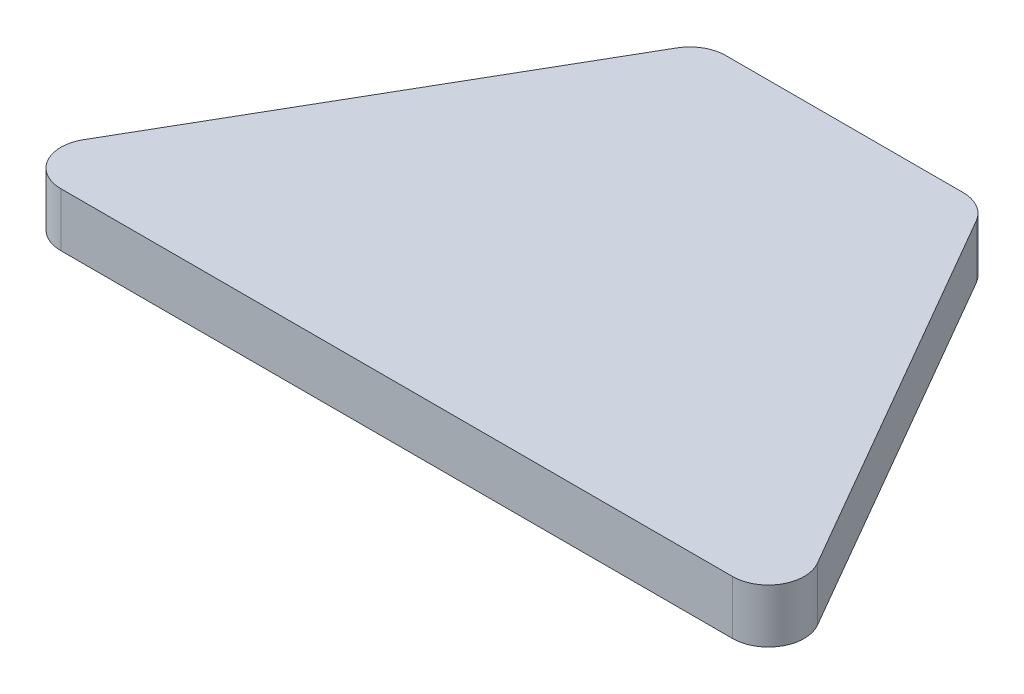
ISO-10303-21;
HEADER;
FILE_DESCRIPTION(('STEP AP214'),'2;1');
FILE_NAME('part.step','',(''),(''),'','','');
FILE_SCHEMA(('AUTOMOTIVE_DESIGN { 1 0 10303 214 1 1 1 1 }'));
ENDSEC;
DATA;
#1=APPLICATION_CONTEXT('core data for automotive mechanical design processes');
#2=APPLICATION_PROTOCOL_DEFINITION('international standard','automotive_design',2000,#1);
#3=PRODUCT_CONTEXT('',#1,'mechanical');
#4=PRODUCT('Part','Part','',(#3));
#5=PRODUCT_RELATED_PRODUCT_CATEGORY('part','',(#4));
#6=PRODUCT_DEFINITION_FORMATION('','',#4);
#7=PRODUCT_DEFINITION_CONTEXT('part definition',#1,'design');
#8=PRODUCT_DEFINITION('design','',#6,#7);
#9=PRODUCT_DEFINITION_SHAPE('','',#8);
#10=(LENGTH_UNIT() NAMED_UNIT(*) SI_UNIT(.MILLI.,.METRE.));
#11=(NAMED_UNIT(*) PLANE_ANGLE_UNIT() SI_UNIT($,.RADIAN.));
#12=(NAMED_UNIT(*) SI_UNIT($,.STERADIAN.) SOLID_ANGLE_UNIT());
#13=UNCERTAINTY_MEASURE_WITH_UNIT(LENGTH_MEASURE(1.E-05),#10,'distance_accuracy_value','');
#14=(GEOMETRIC_REPRESENTATION_CONTEXT(3) GLOBAL_UNCERTAINTY_ASSIGNED_CONTEXT((#13)) GLOBAL_UNIT_ASSIGNED_CONTEXT((#10,
#11,#12)) REPRESENTATION_CONTEXT('',''));
#15=CARTESIAN_POINT('',(0.,0.,0.));
#16=DIRECTION('',(0.,0.,1.));
#17=DIRECTION('',(1.,0.,0.));
#18=AXIS2_PLACEMENT_3D('',#15,#16,#17);
#19=CARTESIAN_POINT('',(22.2168783648704,1.5,12.5));
#20=DIRECTION('',(0.,0.,-1.));
#21=DIRECTION('',(-1.,0.,0.));
#22=AXIS2_PLACEMENT_3D('',#19,#20,#21);
#23=PLANE('',#22);
#24=DIRECTION('',(1.,0.,0.));
#25=VECTOR('',#24,1.);
#26=CARTESIAN_POINT('',(22.2168783648704,-1.5,12.5));
#27=LINE('',#26,#25);
#28=CARTESIAN_POINT('',(-18.7527767497326,-1.5,12.5));
#29=VERTEX_POINT('',#28);
#30=CARTESIAN_POINT('',(18.7527767497326,-1.5,12.5));
#31=VERTEX_POINT('',#30);
#32=EDGE_CURVE('E157',#29,#31,#27,.T.);
#33=ORIENTED_EDGE('',*,*,#32,.T.);
#34=DIRECTION('',(0.,-1.,0.));
#35=VECTOR('',#34,1.);
#36=CARTESIAN_POINT('',(18.7527767497326,1.5,12.5));
#37=LINE('',#36,#35);
#38=CARTESIAN_POINT('',(18.7527767497326,1.5,12.5));
#39=VERTEX_POINT('',#38);
#40=EDGE_CURVE('E11',#31,#39,#37,.F.);
#41=ORIENTED_EDGE('',*,*,#40,.T.);
#42=DIRECTION('',(1.,0.,0.));
#43=VECTOR('',#42,1.);
#44=CARTESIAN_POINT('',(-22.2168783648704,1.5,12.5));
#45=LINE('',#44,#43);
#46=CARTESIAN_POINT('',(-18.7527767497326,1.5,12.5));
#47=VERTEX_POINT('',#46);
#48=EDGE_CURVE('E125',#47,#39,#45,.T.);
#49=ORIENTED_EDGE('',*,*,#48,.F.);
#50=DIRECTION('',(0.,-1.,0.));
#51=VECTOR('',#50,1.);
#52=CARTESIAN_POINT('',(-18.7527767497326,1.5,12.5));
#53=LINE('',#52,#51);
#54=EDGE_CURVE('E41',#47,#29,#53,.T.);
#55=ORIENTED_EDGE('',*,*,#54,.T.);
#56=EDGE_LOOP('',(#33,#41,#49,#55));
#57=FACE_BOUND('',#56,.T.);
#58=ADVANCED_FACE('F33',(#57),#23,.F.);
#59=CARTESIAN_POINT('',(7.7831216351296,1.5,-12.5));
#60=DIRECTION('',(-0.866025403784436,0.,0.500000000000004));
#61=DIRECTION('',(0.500000000000004,0.,0.866025403784437));
#62=AXIS2_PLACEMENT_3D('',#59,#60,#61);
#63=PLANE('',#62);
#64=DIRECTION('',(-0.500000000000004,0.,-0.866025403784436));
#65=VECTOR('',#64,1.);
#66=CARTESIAN_POINT('',(7.7831216351296,-1.5,-12.5));
#67=LINE('',#66,#65);
#68=CARTESIAN_POINT('',(20.4848275573015,-1.5,9.49999999999998));
#69=VERTEX_POINT('',#68);
#70=CARTESIAN_POINT('',(8.36047190431923,-1.5,-11.5));
#71=VERTEX_POINT('',#70);
#72=EDGE_CURVE('E130',#69,#71,#67,.T.);
#73=ORIENTED_EDGE('',*,*,#72,.T.);
#74=DIRECTION('',(0.,-1.,0.));
#75=VECTOR('',#74,1.);
#76=CARTESIAN_POINT('',(8.36047190431923,1.5,-11.5));
#77=LINE('',#76,#75);
#78=CARTESIAN_POINT('',(8.36047190431923,1.5,-11.5));
#79=VERTEX_POINT('',#78);
#80=EDGE_CURVE('E48',#71,#79,#77,.F.);
#81=ORIENTED_EDGE('',*,*,#80,.T.);
#82=DIRECTION('',(-0.500000000000004,0.,-0.866025403784436));
#83=VECTOR('',#82,1.);
#84=CARTESIAN_POINT('',(7.7831216351296,1.5,-12.5));
#85=LINE('',#84,#83);
#86=CARTESIAN_POINT('',(20.4848275573015,1.5,9.49999999999998));
#87=VERTEX_POINT('',#86);
#88=EDGE_CURVE('E128',#87,#79,#85,.T.);
#89=ORIENTED_EDGE('',*,*,#88,.F.);
#90=DIRECTION('',(0.,-1.,0.));
#91=VECTOR('',#90,1.);
#92=CARTESIAN_POINT('',(20.4848275573015,1.5,9.49999999999999));
#93=LINE('',#92,#91);
#94=EDGE_CURVE('E149',#87,#69,#93,.T.);
#95=ORIENTED_EDGE('',*,*,#94,.T.);
#96=EDGE_LOOP('',(#73,#81,#89,#95));
#97=FACE_BOUND('',#96,.T.);
#98=ADVANCED_FACE('F177',(#97),#63,.F.);
#99=CARTESIAN_POINT('',(-7.7831216351296,1.5,-12.5));
#100=DIRECTION('',(0.,0.,1.));
#101=DIRECTION('',(1.,0.,0.));
#102=AXIS2_PLACEMENT_3D('',#99,#100,#101);
#103=PLANE('',#102);
#104=DIRECTION('',(-1.,0.,0.));
#105=VECTOR('',#104,1.);
#106=CARTESIAN_POINT('',(-7.7831216351296,-1.5,-12.5));
#107=LINE('',#106,#105);
#108=CARTESIAN_POINT('',(6.62842109675035,-1.5,-12.5));
#109=VERTEX_POINT('',#108);
#110=CARTESIAN_POINT('',(-6.62842109675035,-1.5,-12.5));
#111=VERTEX_POINT('',#110);
#112=EDGE_CURVE('E126',#109,#111,#107,.T.);
#113=ORIENTED_EDGE('',*,*,#112,.T.);
#114=DIRECTION('',(0.,-1.,0.));
#115=VECTOR('',#114,1.);
#116=CARTESIAN_POINT('',(-6.62842109675035,1.5,-12.5));
#117=LINE('',#116,#115);
#118=CARTESIAN_POINT('',(-6.62842109675035,1.5,-12.5));
#119=VERTEX_POINT('',#118);
#120=EDGE_CURVE('E104',#111,#119,#117,.F.);
#121=ORIENTED_EDGE('',*,*,#120,.T.);
#122=DIRECTION('',(-1.,0.,0.));
#123=VECTOR('',#122,1.);
#124=CARTESIAN_POINT('',(-7.7831216351296,1.5,-12.5));
#125=LINE('',#124,#123);
#126=CARTESIAN_POINT('',(6.62842109675035,1.5,-12.5));
#127=VERTEX_POINT('',#126);
#128=EDGE_CURVE('E165',#127,#119,#125,.T.);
#129=ORIENTED_EDGE('',*,*,#128,.F.);
#130=DIRECTION('',(0.,-1.,0.));
#131=VECTOR('',#130,1.);
#132=CARTESIAN_POINT('',(6.62842109675035,1.5,-12.5));
#133=LINE('',#132,#131);
#134=EDGE_CURVE('E109',#127,#109,#133,.T.);
#135=ORIENTED_EDGE('',*,*,#134,.T.);
#136=EDGE_LOOP('',(#113,#121,#129,#135));
#137=FACE_BOUND('',#136,.T.);
#138=ADVANCED_FACE('F176',(#137),#103,.F.);
#139=CARTESIAN_POINT('',(-7.7831216351296,1.5,-12.5));
#140=DIRECTION('',(0.866025403784436,0.,0.500000000000004));
#141=DIRECTION('',(0.500000000000004,0.,-0.866025403784436));
#142=AXIS2_PLACEMENT_3D('',#139,#140,#141);
#143=PLANE('',#142);
#144=DIRECTION('',(-0.500000000000004,0.,0.866025403784436));
#145=VECTOR('',#144,1.);
#146=CARTESIAN_POINT('',(-7.7831216351296,1.5,-12.5));
#147=LINE('',#146,#145);
#148=CARTESIAN_POINT('',(-8.36047190431923,1.5,-11.5));
#149=VERTEX_POINT('',#148);
#150=CARTESIAN_POINT('',(-20.4848275573015,1.5,9.49999999999999));
#151=VERTEX_POINT('',#150);
#152=EDGE_CURVE('E119',#149,#151,#147,.T.);
#153=ORIENTED_EDGE('',*,*,#152,.F.);
#154=DIRECTION('',(0.,-1.,0.));
#155=VECTOR('',#154,1.);
#156=CARTESIAN_POINT('',(-8.36047190431923,1.5,-11.5));
#157=LINE('',#156,#155);
#158=CARTESIAN_POINT('',(-8.36047190431923,-1.5,-11.5));
#159=VERTEX_POINT('',#158);
#160=EDGE_CURVE('E103',#149,#159,#157,.T.);
#161=ORIENTED_EDGE('',*,*,#160,.T.);
#162=DIRECTION('',(-0.500000000000004,0.,0.866025403784436));
#163=VECTOR('',#162,1.);
#164=CARTESIAN_POINT('',(-7.7831216351296,-1.5,-12.5));
#165=LINE('',#164,#163);
#166=CARTESIAN_POINT('',(-20.4848275573015,-1.5,9.49999999999999));
#167=VERTEX_POINT('',#166);
#168=EDGE_CURVE('E116',#159,#167,#165,.T.);
#169=ORIENTED_EDGE('',*,*,#168,.T.);
#170=DIRECTION('',(0.,-1.,0.));
#171=VECTOR('',#170,1.);
#172=CARTESIAN_POINT('',(-20.4848275573015,1.5,9.49999999999999));
#173=LINE('',#172,#171);
#174=EDGE_CURVE('E121',#167,#151,#173,.F.);
#175=ORIENTED_EDGE('',*,*,#174,.T.);
#176=EDGE_LOOP('',(#153,#161,#169,#175));
#177=FACE_BOUND('',#176,.T.);
#178=ADVANCED_FACE('F115',(#177),#143,.F.);
#179=CARTESIAN_POINT('',(0.,1.5,0.));
#180=DIRECTION('',(0.,-1.,0.));
#181=DIRECTION('',(0.,0.,-1.));
#182=AXIS2_PLACEMENT_3D('',#179,#180,#181);
#183=PLANE('',#182);
#184=ORIENTED_EDGE('',*,*,#128,.T.);
#185=CARTESIAN_POINT('',(-6.62842109675035,1.5,-10.5));
#186=DIRECTION('',(0.,-1.,0.));
#187=DIRECTION('',(0.,0.,-1.));
#188=AXIS2_PLACEMENT_3D('',#185,#186,#187);
#189=CIRCLE('',#188,2.);
#190=EDGE_CURVE('E147',#119,#149,#189,.F.);
#191=ORIENTED_EDGE('',*,*,#190,.T.);
#192=ORIENTED_EDGE('',*,*,#152,.T.);
#193=CARTESIAN_POINT('',(-18.7527767497326,1.5,10.5));
#194=DIRECTION('',(0.,-1.,0.));
#195=DIRECTION('',(0.,0.,-1.));
#196=AXIS2_PLACEMENT_3D('',#193,#194,#195);
#197=CIRCLE('',#196,2.);
#198=EDGE_CURVE('E142',#151,#47,#197,.F.);
#199=ORIENTED_EDGE('',*,*,#198,.T.);
#200=ORIENTED_EDGE('',*,*,#48,.T.);
#201=CARTESIAN_POINT('',(18.7527767497326,1.5,10.5));
#202=DIRECTION('',(0.,-1.,0.));
#203=DIRECTION('',(0.,0.,-1.));
#204=AXIS2_PLACEMENT_3D('',#201,#202,#203);
#205=CIRCLE('',#204,2.);
#206=EDGE_CURVE('E55',#39,#87,#205,.F.);
#207=ORIENTED_EDGE('',*,*,#206,.T.);
#208=ORIENTED_EDGE('',*,*,#88,.T.);
#209=CARTESIAN_POINT('',(6.62842109675035,1.5,-10.5));
#210=DIRECTION('',(0.,-1.,0.));
#211=DIRECTION('',(0.,0.,-1.));
#212=AXIS2_PLACEMENT_3D('',#209,#210,#211);
#213=CIRCLE('',#212,2.);
#214=EDGE_CURVE('E145',#79,#127,#213,.F.);
#215=ORIENTED_EDGE('',*,*,#214,.T.);
#216=EDGE_LOOP('',(#184,#191,#192,#199,#200,#207,#208,#215));
#217=FACE_BOUND('',#216,.T.);
#218=ADVANCED_FACE('F169',(#217),#183,.F.);
#219=CARTESIAN_POINT('',(0.,-1.5,0.));
#220=DIRECTION('',(0.,-1.,0.));
#221=DIRECTION('',(0.,0.,-1.));
#222=AXIS2_PLACEMENT_3D('',#219,#220,#221);
#223=PLANE('',#222);
#224=ORIENTED_EDGE('',*,*,#168,.F.);
#225=CARTESIAN_POINT('',(-6.62842109675035,-1.5,-10.5));
#226=DIRECTION('',(0.,-1.,0.));
#227=DIRECTION('',(0.,0.,-1.));
#228=AXIS2_PLACEMENT_3D('',#225,#226,#227);
#229=CIRCLE('',#228,2.);
#230=EDGE_CURVE('E99',#159,#111,#229,.T.);
#231=ORIENTED_EDGE('',*,*,#230,.T.);
#232=ORIENTED_EDGE('',*,*,#112,.F.);
#233=CARTESIAN_POINT('',(6.62842109675035,-1.5,-10.5));
#234=DIRECTION('',(0.,-1.,0.));
#235=DIRECTION('',(0.,0.,-1.));
#236=AXIS2_PLACEMENT_3D('',#233,#234,#235);
#237=CIRCLE('',#236,2.);
#238=EDGE_CURVE('E110',#109,#71,#237,.T.);
#239=ORIENTED_EDGE('',*,*,#238,.T.);
#240=ORIENTED_EDGE('',*,*,#72,.F.);
#241=CARTESIAN_POINT('',(18.7527767497326,-1.5,10.5));
#242=DIRECTION('',(0.,-1.,0.));
#243=DIRECTION('',(0.,0.,-1.));
#244=AXIS2_PLACEMENT_3D('',#241,#242,#243);
#245=CIRCLE('',#244,2.);
#246=EDGE_CURVE('E136',#69,#31,#245,.T.);
#247=ORIENTED_EDGE('',*,*,#246,.T.);
#248=ORIENTED_EDGE('',*,*,#32,.F.);
#249=CARTESIAN_POINT('',(-18.7527767497326,-1.5,10.5));
#250=DIRECTION('',(0.,-1.,0.));
#251=DIRECTION('',(0.,0.,-1.));
#252=AXIS2_PLACEMENT_3D('',#249,#250,#251);
#253=CIRCLE('',#252,2.);
#254=EDGE_CURVE('E120',#29,#167,#253,.T.);
#255=ORIENTED_EDGE('',*,*,#254,.T.);
#256=EDGE_LOOP('',(#224,#231,#232,#239,#240,#247,#248,#255));
#257=FACE_BOUND('',#256,.T.);
#258=ADVANCED_FACE('F123',(#257),#223,.T.);
#259=CARTESIAN_POINT('',(-6.62842109675035,1.5,-10.5));
#260=DIRECTION('',(0.,-1.,0.));
#261=DIRECTION('',(0.,0.,-1.));
#262=AXIS2_PLACEMENT_3D('',#259,#260,#261);
#263=CYLINDRICAL_SURFACE('',#262,2.);
#264=ORIENTED_EDGE('',*,*,#190,.F.);
#265=ORIENTED_EDGE('',*,*,#120,.F.);
#266=ORIENTED_EDGE('',*,*,#230,.F.);
#267=ORIENTED_EDGE('',*,*,#160,.F.);
#268=EDGE_LOOP('',(#264,#265,#266,#267));
#269=FACE_BOUND('',#268,.T.);
#270=ADVANCED_FACE('F102',(#269),#263,.T.);
#271=CARTESIAN_POINT('',(6.62842109675035,1.5,-10.5));
#272=DIRECTION('',(0.,-1.,0.));
#273=DIRECTION('',(0.,0.,-1.));
#274=AXIS2_PLACEMENT_3D('',#271,#272,#273);
#275=CYLINDRICAL_SURFACE('',#274,2.);
#276=ORIENTED_EDGE('',*,*,#214,.F.);
#277=ORIENTED_EDGE('',*,*,#80,.F.);
#278=ORIENTED_EDGE('',*,*,#238,.F.);
#279=ORIENTED_EDGE('',*,*,#134,.F.);
#280=EDGE_LOOP('',(#276,#277,#278,#279));
#281=FACE_BOUND('',#280,.T.);
#282=ADVANCED_FACE('F174',(#281),#275,.T.);
#283=CARTESIAN_POINT('',(18.7527767497326,1.5,10.5));
#284=DIRECTION('',(0.,-1.,0.));
#285=DIRECTION('',(0.,0.,-1.));
#286=AXIS2_PLACEMENT_3D('',#283,#284,#285);
#287=CYLINDRICAL_SURFACE('',#286,2.);
#288=ORIENTED_EDGE('',*,*,#206,.F.);
#289=ORIENTED_EDGE('',*,*,#40,.F.);
#290=ORIENTED_EDGE('',*,*,#246,.F.);
#291=ORIENTED_EDGE('',*,*,#94,.F.);
#292=EDGE_LOOP('',(#288,#289,#290,#291));
#293=FACE_BOUND('',#292,.T.);
#294=ADVANCED_FACE('F179',(#293),#287,.T.);
#295=CARTESIAN_POINT('',(-18.7527767497326,1.5,10.5));
#296=DIRECTION('',(0.,-1.,0.));
#297=DIRECTION('',(0.,0.,-1.));
#298=AXIS2_PLACEMENT_3D('',#295,#296,#297);
#299=CYLINDRICAL_SURFACE('',#298,2.);
#300=ORIENTED_EDGE('',*,*,#198,.F.);
#301=ORIENTED_EDGE('',*,*,#174,.F.);
#302=ORIENTED_EDGE('',*,*,#254,.F.);
#303=ORIENTED_EDGE('',*,*,#54,.F.);
#304=EDGE_LOOP('',(#300,#301,#302,#303));
#305=FACE_BOUND('',#304,.T.);
#306=ADVANCED_FACE('F35',(#305),#299,.T.);
#307=CLOSED_SHELL('',(#58,#98,#138,#178,#218,#258,#270,#282,#294,#306));
#308=MANIFOLD_SOLID_BREP('B2',#307);
#309=ADVANCED_BREP_SHAPE_REPRESENTATION('',(#18,#308),#14);
#310=SHAPE_DEFINITION_REPRESENTATION(#9,#309);
ENDSEC;
END-ISO-10303-21;
